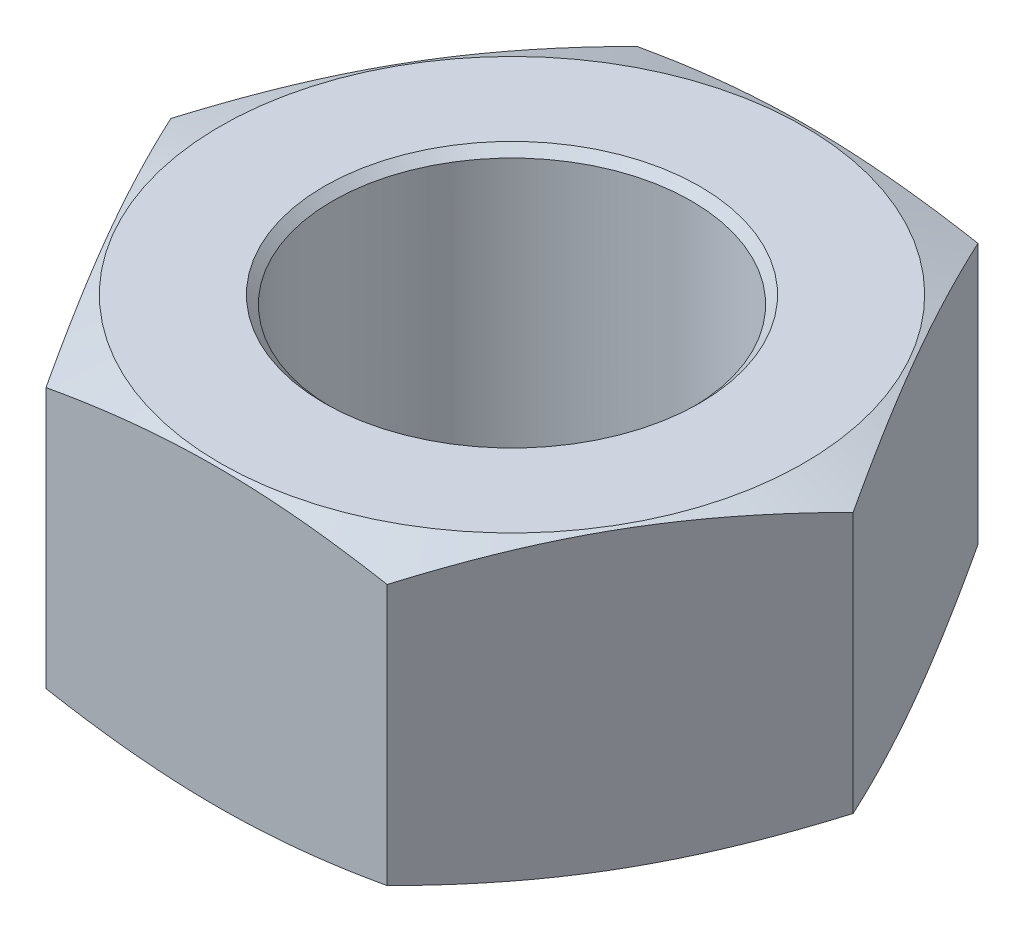
ISO-10303-21;
HEADER;
FILE_DESCRIPTION(('STEP AP214'),'2;1');
FILE_NAME('part.step','',(''),(''),'','','');
FILE_SCHEMA(('AUTOMOTIVE_DESIGN { 1 0 10303 214 1 1 1 1 }'));
ENDSEC;
DATA;
#1=APPLICATION_CONTEXT('core data for automotive mechanical design processes');
#2=APPLICATION_PROTOCOL_DEFINITION('international standard','automotive_design',2000,#1);
#3=PRODUCT_CONTEXT('',#1,'mechanical');
#4=PRODUCT('Part','Part','',(#3));
#5=PRODUCT_RELATED_PRODUCT_CATEGORY('part','',(#4));
#6=PRODUCT_DEFINITION_FORMATION('','',#4);
#7=PRODUCT_DEFINITION_CONTEXT('part definition',#1,'design');
#8=PRODUCT_DEFINITION('design','',#6,#7);
#9=PRODUCT_DEFINITION_SHAPE('','',#8);
#10=(LENGTH_UNIT() NAMED_UNIT(*) SI_UNIT(.MILLI.,.METRE.));
#11=(NAMED_UNIT(*) PLANE_ANGLE_UNIT() SI_UNIT($,.RADIAN.));
#12=(NAMED_UNIT(*) SI_UNIT($,.STERADIAN.) SOLID_ANGLE_UNIT());
#13=UNCERTAINTY_MEASURE_WITH_UNIT(LENGTH_MEASURE(1.E-05),#10,'distance_accuracy_value','');
#14=(GEOMETRIC_REPRESENTATION_CONTEXT(3) GLOBAL_UNCERTAINTY_ASSIGNED_CONTEXT((#13)) GLOBAL_UNIT_ASSIGNED_CONTEXT((#10,
#11,#12)) REPRESENTATION_CONTEXT('',''));
#15=CARTESIAN_POINT('',(0.,0.,0.));
#16=DIRECTION('',(0.,0.,1.));
#17=DIRECTION('',(1.,0.,0.));
#18=AXIS2_PLACEMENT_3D('',#15,#16,#17);
#19=CARTESIAN_POINT('',(8.08290376865476,7.,0.));
#20=DIRECTION('',(-0.866025403784438,0.,0.5));
#21=DIRECTION('',(0.5,0.,0.866025403784439));
#22=AXIS2_PLACEMENT_3D('',#19,#20,#21);
#23=PLANE('',#22);
#24=CARTESIAN_POINT('',(4.04133641427354,0.396064374006002,-7.0002));
#25=CARTESIAN_POINT('',(4.20871133711686,0.335122246639037,-6.71029812972245));
#26=CARTESIAN_POINT('',(4.37663818867554,0.279684845159646,-6.41944029086774));
#27=CARTESIAN_POINT('',(4.71358376499552,0.182151327336367,-5.83583343329596));
#28=CARTESIAN_POINT('',(4.88260323922986,0.140065650577549,-5.5430831164535));
#29=CARTESIAN_POINT('',(5.21985834048189,0.0719932787650601,-4.9589401459732));
#30=CARTESIAN_POINT('',(5.3880862654455,0.0458581080277518,-4.66756083268435));
#31=CARTESIAN_POINT('',(5.72493551662129,0.0108034998647018,-4.08412081515635));
#32=CARTESIAN_POINT('',(5.89355667155618,0.0018776070778526,-3.79206040757817));
#33=CARTESIAN_POINT('',(6.23079898142596,0.00187760707785253,-3.20793959242183));
#34=CARTESIAN_POINT('',(6.39942013636085,0.0108034998647017,-2.91587918484365));
#35=CARTESIAN_POINT('',(6.73626938753664,0.0458581080277515,-2.33243916731566));
#36=CARTESIAN_POINT('',(6.90449731250025,0.0719932787650598,-2.0410598540268));
#37=CARTESIAN_POINT('',(7.24175241375227,0.140065650577549,-1.45691688354651));
#38=CARTESIAN_POINT('',(7.41077188798662,0.182151327336367,-1.16416656670404));
#39=CARTESIAN_POINT('',(7.7477174643066,0.279684845159646,-0.58055970913226));
#40=CARTESIAN_POINT('',(7.91564431586528,0.335122246639037,-0.289701870277549));
#41=CARTESIAN_POINT('',(8.0830192387086,0.396064374006002,0.000199999999998937));
#42=B_SPLINE_CURVE_WITH_KNOTS('',3,(#24,#25,#26,#27,#28,#29,#30,#31,#32,#33,#34,#35,#36,#37,#38,
#39,#40,#41),.UNSPECIFIED.,.F.,.F.,(4,2,2,2,2,2,2,2,4),(0.,1.02086119756332,2.04251864059741,
3.05451483401204,4.06613134427776,5.07774785454349,6.08974404795813,7.11140149099221,
8.13226268855553),.UNSPECIFIED.);
#43=CARTESIAN_POINT('',(4.04145188432738,0.396022345442876,-7.));
#44=VERTEX_POINT('',#43);
#45=CARTESIAN_POINT('',(8.08290376865476,0.396022345442876,0.));
#46=VERTEX_POINT('',#45);
#47=EDGE_CURVE('E53',#44,#46,#42,.T.);
#48=ORIENTED_EDGE('',*,*,#47,.F.);
#49=DIRECTION('',(0.,-1.,0.));
#50=VECTOR('',#49,1.);
#51=CARTESIAN_POINT('',(4.04145188432738,7.,-7.));
#52=LINE('',#51,#50);
#53=CARTESIAN_POINT('',(4.04145188432738,6.57467753879998,-7.));
#54=VERTEX_POINT('',#53);
#55=EDGE_CURVE('E123',#54,#44,#52,.T.);
#56=ORIENTED_EDGE('',*,*,#55,.F.);
#57=CARTESIAN_POINT('',(8.0830192387086,6.57463551023685,0.000199999999998542));
#58=CARTESIAN_POINT('',(7.91564431586528,6.63557763760382,-0.289701870277549));
#59=CARTESIAN_POINT('',(7.7477174643066,6.69101503908321,-0.58055970913226));
#60=CARTESIAN_POINT('',(7.41077188798662,6.78854855690649,-1.16416656670404));
#61=CARTESIAN_POINT('',(7.24175241375227,6.83063423366531,-1.45691688354651));
#62=CARTESIAN_POINT('',(6.90449731250025,6.89870660547779,-2.0410598540268));
#63=CARTESIAN_POINT('',(6.73626938753664,6.9248417762151,-2.33243916731566));
#64=CARTESIAN_POINT('',(6.39942013636085,6.95989638437815,-2.91587918484365));
#65=CARTESIAN_POINT('',(6.23079898142596,6.968822277165,-3.20793959242183));
#66=CARTESIAN_POINT('',(5.89355667155618,6.968822277165,-3.79206040757817));
#67=CARTESIAN_POINT('',(5.72493551662129,6.95989638437815,-4.08412081515635));
#68=CARTESIAN_POINT('',(5.3880862654455,6.9248417762151,-4.66756083268435));
#69=CARTESIAN_POINT('',(5.21985834048189,6.89870660547779,-4.9589401459732));
#70=CARTESIAN_POINT('',(4.88260323922986,6.83063423366531,-5.5430831164535));
#71=CARTESIAN_POINT('',(4.71358376499552,6.78854855690649,-5.83583343329596));
#72=CARTESIAN_POINT('',(4.37663818867554,6.69101503908321,-6.41944029086774));
#73=CARTESIAN_POINT('',(4.20871133711686,6.63557763760382,-6.71029812972245));
#74=CARTESIAN_POINT('',(4.04133641427354,6.57463551023685,-7.0002));
#75=B_SPLINE_CURVE_WITH_KNOTS('',3,(#57,#58,#59,#60,#61,#62,#63,#64,#65,#66,#67,#68,#69,#70,#71,
#72,#73,#74),.UNSPECIFIED.,.F.,.F.,(4,2,2,2,2,2,2,2,4),(0.,1.02086119756332,2.04251864059741,
3.05451483401204,4.06613134427776,5.07774785454349,6.08974404795813,7.11140149099221,
8.13226268855553),.UNSPECIFIED.);
#76=CARTESIAN_POINT('',(8.08290376865476,6.57467753879998,0.));
#77=VERTEX_POINT('',#76);
#78=EDGE_CURVE('E158',#77,#54,#75,.T.);
#79=ORIENTED_EDGE('',*,*,#78,.F.);
#80=DIRECTION('',(0.,-1.,0.));
#81=VECTOR('',#80,1.);
#82=CARTESIAN_POINT('',(8.08290376865476,7.,0.));
#83=LINE('',#82,#81);
#84=EDGE_CURVE('E110',#77,#46,#83,.T.);
#85=ORIENTED_EDGE('',*,*,#84,.T.);
#86=EDGE_LOOP('',(#48,#56,#79,#85));
#87=FACE_BOUND('',#86,.T.);
#88=ADVANCED_FACE('F38',(#87),#23,.F.);
#89=CARTESIAN_POINT('',(4.04145188432738,7.,-7.));
#90=DIRECTION('',(0.,0.,1.));
#91=DIRECTION('',(1.,0.,0.));
#92=AXIS2_PLACEMENT_3D('',#89,#90,#91);
#93=PLANE('',#92);
#94=CARTESIAN_POINT('',(-10.8288839499322,2.14725212980072,-7.));
#95=CARTESIAN_POINT('',(-10.5103546094838,2.0499147553114,-7.));
#96=CARTESIAN_POINT('',(-10.1914801724842,1.95368649307686,-7.));
#97=CARTESIAN_POINT('',(-9.55286470063456,1.76406263347738,-7.));
#98=CARTESIAN_POINT('',(-9.23312360158148,1.67066725258925,-7.));
#99=CARTESIAN_POINT('',(-8.59210324325858,1.48718300549259,-7.));
#100=CARTESIAN_POINT('',(-8.27082229420456,1.39710002195854,-7.));
#101=CARTESIAN_POINT('',(-7.62708086199487,1.22125815747448,-7.));
#102=CARTESIAN_POINT('',(-7.30462039951449,1.13549920111592,-7.));
#103=CARTESIAN_POINT('',(-6.66301371562166,0.970590561460358,-7.));
#104=CARTESIAN_POINT('',(-6.34388766364484,0.891362783385371,-7.));
#105=CARTESIAN_POINT('',(-5.70406379199733,0.739459921329114,-7.));
#106=CARTESIAN_POINT('',(-5.38336594666204,0.666784944721844,-7.));
#107=CARTESIAN_POINT('',(-4.74028409918753,0.529632904917309,-7.));
#108=CARTESIAN_POINT('',(-4.41790049972417,0.465153969419512,-7.));
#109=CARTESIAN_POINT('',(-3.77125819758374,0.346322547099357,-7.));
#110=CARTESIAN_POINT('',(-3.44699955402845,0.291969742766986,-7.));
#111=CARTESIAN_POINT('',(-2.83271052104426,0.20090600889886,-7.));
#112=CARTESIAN_POINT('',(-2.54287287941538,0.162906971624213,-7.));
#113=CARTESIAN_POINT('',(-1.96193465266254,0.0981435439813421,-7.));
#114=CARTESIAN_POINT('',(-1.67083410488204,0.0713788236772363,-7.));
#115=CARTESIAN_POINT('',(-1.08798926355639,0.0303704099183644,-7.));
#116=CARTESIAN_POINT('',(-0.796245737421936,0.0161159846260388,-7.));
#117=CARTESIAN_POINT('',(-0.212408622772339,0.000847017679897926,-7.));
#118=CARTESIAN_POINT('',(0.0796849629010389,-0.000167630735438414,-7.));
#119=CARTESIAN_POINT('',(0.66563447444041,0.0111386033102869,-7.));
#120=CARTESIAN_POINT('',(0.959488588099098,0.0235519348918809,-7.));
#121=CARTESIAN_POINT('',(1.54636923330975,0.0611843169462709,-7.));
#122=CARTESIAN_POINT('',(1.83939574231318,0.086403713006614,-7.));
#123=CARTESIAN_POINT('',(2.42449575038683,0.148442077607243,-7.));
#124=CARTESIAN_POINT('',(2.71656800891666,0.185272579229821,-7.));
#125=CARTESIAN_POINT('',(3.29923932227263,0.268997693771006,-7.));
#126=CARTESIAN_POINT('',(3.58983841119636,0.315892072655093,-7.));
#127=CARTESIAN_POINT('',(4.29347170917687,0.440033587463134,-7.));
#128=CARTESIAN_POINT('',(4.7057250046913,0.521685271153699,-7.));
#129=CARTESIAN_POINT('',(5.52742475762459,0.698168723283092,-7.));
#130=CARTESIAN_POINT('',(5.93687069848898,0.793002852442231,-7.));
#131=CARTESIAN_POINT('',(6.75358315639123,0.992642791392257,-7.));
#132=CARTESIAN_POINT('',(7.16084810211974,1.09745497614811,-7.));
#133=CARTESIAN_POINT('',(7.97334250308076,1.3145415387155,-7.));
#134=CARTESIAN_POINT('',(8.37857208453993,1.4268154474727,-7.));
#135=CARTESIAN_POINT('',(9.18839221363026,1.6573159878492,-7.));
#136=CARTESIAN_POINT('',(9.59297881421302,1.77555642442952,-7.));
#137=CARTESIAN_POINT('',(10.4008458876181,2.01642009167769,-7.));
#138=CARTESIAN_POINT('',(10.8041263454444,2.13904337247286,-7.));
#139=CARTESIAN_POINT('',(11.6094819513514,2.38765637193747,-7.));
#140=CARTESIAN_POINT('',(12.0115574910568,2.51364482492323,-7.));
#141=CARTESIAN_POINT('',(12.8148492646953,2.76832032701244,-7.));
#142=CARTESIAN_POINT('',(13.2160655026799,2.8970073633615,-7.));
#143=CARTESIAN_POINT('',(14.4013628039604,3.2806775720889,-7.));
#144=CARTESIAN_POINT('',(15.184462619904,3.53869025816283,-7.));
#145=CARTESIAN_POINT('',(16.7489191895378,4.06020503900663,-7.));
#146=CARTESIAN_POINT('',(17.5302757428736,4.32370773205579,-7.));
#147=CARTESIAN_POINT('',(19.0872079467471,4.85302635545361,-7.));
#148=CARTESIAN_POINT('',(19.8627910578921,5.11882036299614,-7.));
#149=CARTESIAN_POINT('',(21.0254021708859,5.51955624735791,-7.));
#150=CARTESIAN_POINT('',(21.4127864013356,5.65346677997084,-7.));
#151=CARTESIAN_POINT('',(22.1873469814177,5.92188592528232,-7.));
#152=CARTESIAN_POINT('',(22.5745233313585,6.05639453709059,-7.));
#153=CARTESIAN_POINT('',(22.9616110780881,6.19115776759808,-7.));
#154=B_SPLINE_CURVE_WITH_KNOTS('',3,(#94,#95,#96,#97,#98,#99,#100,#101,#102,#103,#104,#105,#106,
#107,#108,#109,#110,#111,#112,#113,#114,#115,#116,#117,#118,#119,#120,#121,#122,#123,#124,#125,
#126,#127,#128,#129,#130,#131,#132,#133,#134,#135,#136,#137,#138,#139,#140,#141,#142,#143,#144,
#145,#146,#147,#148,#149,#150,#151,#152,#153),.UNSPECIFIED.,.F.,.F.,(4,2,2,2,2,2,2,2,2,2,2,2,2,
2,2,2,2,2,2,2,2,2,2,2,2,2,2,2,2,4),(0.,0.999216279059921,1.99850872261269,2.99949767093117,
4.0004691565376,4.98685575676647,5.97325851695896,6.95943553716344,7.94558163007766,
8.82234670627914,9.69908603133767,10.5750725166995,11.4510519383692,12.3331009238614,
13.2151737138057,14.0981254244802,14.9810566044203,16.2415328125197,17.5022350389645,
18.7637482020018,20.0251821394413,21.2896820170662,22.554196361619,23.818241623565,
25.082280912561,27.5557739825682,30.0295380287597,32.4891198013207,33.7187483486324,
34.9483750662024),.UNSPECIFIED.);
#155=CARTESIAN_POINT('',(-4.04145188432738,0.396022345442877,-7.));
#156=VERTEX_POINT('',#155);
#157=EDGE_CURVE('E174',#156,#44,#154,.T.);
#158=ORIENTED_EDGE('',*,*,#157,.F.);
#159=DIRECTION('',(0.,-1.,0.));
#160=VECTOR('',#159,1.);
#161=CARTESIAN_POINT('',(-4.04145188432738,7.,-7.));
#162=LINE('',#161,#160);
#163=CARTESIAN_POINT('',(-4.04145188432738,6.57467753879998,-7.));
#164=VERTEX_POINT('',#163);
#165=EDGE_CURVE('E120',#164,#156,#162,.T.);
#166=ORIENTED_EDGE('',*,*,#165,.F.);
#167=CARTESIAN_POINT('',(-10.8240084136491,4.82493794934905,-7.));
#168=CARTESIAN_POINT('',(-10.5055308173541,4.92224656897644,-7.));
#169=CARTESIAN_POINT('',(-10.1867079395454,5.01844535323185,-7.));
#170=CARTESIAN_POINT('',(-9.54819513137422,5.20800839484679,-7.));
#171=CARTESIAN_POINT('',(-9.22850513667269,5.30137243523613,-7.));
#172=CARTESIAN_POINT('',(-8.58758547741601,5.48479197085715,-7.));
#173=CARTESIAN_POINT('',(-8.26635411877152,5.57484156729345,-7.));
#174=CARTESIAN_POINT('',(-7.62271136787224,5.75061376866334,-7.));
#175=CARTESIAN_POINT('',(-7.30029999633585,5.83633644918072,-7.));
#176=CARTESIAN_POINT('',(-6.65879828459734,6.00116750922599,-7.));
#177=CARTESIAN_POINT('',(-6.33972815490249,6.08035416624466,-7.));
#178=CARTESIAN_POINT('',(-5.70001584284803,6.23217107284474,-7.));
#179=CARTESIAN_POINT('',(-5.37937363480482,6.30480121493127,-7.));
#180=CARTESIAN_POINT('',(-4.73640364991016,6.44185933588268,-7.));
#181=CARTESIAN_POINT('',(-4.41407627902635,6.50628920330615,-7.));
#182=CARTESIAN_POINT('',(-3.76754696125269,6.62501836866435,-7.));
#183=CARTESIAN_POINT('',(-3.44334507358089,6.67931798484162,-7.));
#184=CARTESIAN_POINT('',(-2.82917617271211,6.77027638187317,-7.));
#185=CARTESIAN_POINT('',(-2.53940183260569,6.80822401100627,-7.));
#186=CARTESIAN_POINT('',(-1.95859192158745,6.8728843624809,-7.));
#187=CARTESIAN_POINT('',(-1.66755638799729,6.89959741501675,-7.));
#188=CARTESIAN_POINT('',(-1.0848432623255,6.94050465180896,-7.));
#189=CARTESIAN_POINT('',(-0.793166434547837,6.9547095484949,-7.));
#190=CARTESIAN_POINT('',(-0.209464911720636,6.96988428213895,-7.));
#191=CARTESIAN_POINT('',(0.0825597805388067,6.97085422454456,-7.));
#192=CARTESIAN_POINT('',(0.668372835377888,6.95946555254062,-7.));
#193=CARTESIAN_POINT('',(0.962159369824402,6.94701437349206,-7.));
#194=CARTESIAN_POINT('',(1.54890375241079,6.90931500259176,-7.));
#195=CARTESIAN_POINT('',(1.84186157797401,6.8840664654123,-7.));
#196=CARTESIAN_POINT('',(2.42682371060595,6.82197890274991,-7.));
#197=CARTESIAN_POINT('',(2.71882677751656,6.78512835942758,-7.));
#198=CARTESIAN_POINT('',(3.30136001363118,6.70137164138962,-7.));
#199=CARTESIAN_POINT('',(3.59189021714083,6.65446570199405,-7.));
#200=CARTESIAN_POINT('',(4.29591172682075,6.53020715835121,-7.));
#201=CARTESIAN_POINT('',(4.70861839516711,6.44843063706516,-7.));
#202=CARTESIAN_POINT('',(5.53121961611645,6.27167832197565,-7.));
#203=CARTESIAN_POINT('',(5.94111365008252,6.17670015902581,-7.));
#204=CARTESIAN_POINT('',(6.75871928435894,5.97676083796844,-7.));
#205=CARTESIAN_POINT('',(7.16642930834378,5.87179328714549,-7.));
#206=CARTESIAN_POINT('',(7.97981135309997,5.65438980965387,-7.));
#207=CARTESIAN_POINT('',(8.38548350057627,5.54195435364193,-7.));
#208=CARTESIAN_POINT('',(9.19618908932204,5.3111267907803,-7.));
#209=CARTESIAN_POINT('',(9.60121857701305,5.19272086061553,-7.));
#210=CARTESIAN_POINT('',(10.4099705668438,4.95152451801167,-7.));
#211=CARTESIAN_POINT('',(10.8136930539317,4.82873405527329,-7.));
#212=CARTESIAN_POINT('',(11.6199318152718,4.57978610351217,-7.));
#213=CARTESIAN_POINT('',(12.0224484819861,4.45362988256405,-7.));
#214=CARTESIAN_POINT('',(12.8266222552163,4.19861865452416,-7.));
#215=CARTESIAN_POINT('',(13.2282793657932,4.06976366021396,-7.));
#216=CARTESIAN_POINT('',(14.4147995035738,3.68562309580923,-7.));
#217=CARTESIAN_POINT('',(15.1986814181995,3.42730901725608,-7.));
#218=CARTESIAN_POINT('',(16.7647029115578,2.90519359165718,-7.));
#219=CARTESIAN_POINT('',(17.546842289611,2.64139164544921,-7.));
#220=CARTESIAN_POINT('',(19.1053355153589,2.1114783806791,-7.));
#221=CARTESIAN_POINT('',(19.8816968218466,1.84538897698207,-7.));
#222=CARTESIAN_POINT('',(21.0454754652962,1.44421124070768,-7.));
#223=CARTESIAN_POINT('',(21.4332488571115,1.31015365107045,-7.));
#224=CARTESIAN_POINT('',(22.2085878686218,1.04144075587337,-7.));
#225=CARTESIAN_POINT('',(22.5961534886243,0.90678545120091,-7.));
#226=CARTESIAN_POINT('',(22.983630555226,0.771875691808589,-7.));
#227=B_SPLINE_CURVE_WITH_KNOTS('',3,(#167,#168,#169,#170,#171,#172,#173,#174,#175,#176,#177,
#178,#179,#180,#181,#182,#183,#184,#185,#186,#187,#188,#189,#190,#191,#192,#193,#194,#195,#196,
#197,#198,#199,#200,#201,#202,#203,#204,#205,#206,#207,#208,#209,#210,#211,#212,#213,#214,#215,
#216,#217,#218,#219,#220,#221,#222,#223,#224,#225,#226),.UNSPECIFIED.,.F.,.F.,(4,2,2,2,2,2,2,2,
2,2,2,2,2,2,2,2,2,2,2,2,2,2,2,2,2,2,2,2,2,4),(0.,0.999042624072088,1.99816152269297,
2.99898014861877,3.99978128590735,4.98597526791184,5.97218541575433,6.95816802256749,
7.94411964945086,8.82067631436884,9.69720721469674,10.5729866905991,11.4487591888565,
12.3306107126278,13.2124860338102,14.0952396080554,14.9779725260343,16.2398549344268,
17.5019640913832,18.7648864379689,20.027729265612,21.2936437363914,22.5595727343897,
23.825031338086,25.0904839498416,27.5664884808426,30.0427647742738,32.5048423574256,
33.735718458982,34.9665927337716),.UNSPECIFIED.);
#228=EDGE_CURVE('E225',#54,#164,#227,.F.);
#229=ORIENTED_EDGE('',*,*,#228,.F.);
#230=ORIENTED_EDGE('',*,*,#55,.T.);
#231=EDGE_LOOP('',(#158,#166,#229,#230));
#232=FACE_BOUND('',#231,.T.);
#233=ADVANCED_FACE('F145',(#232),#93,.F.);
#234=CARTESIAN_POINT('',(-4.04145188432738,7.,-7.));
#235=DIRECTION('',(0.866025403784439,0.,0.5));
#236=DIRECTION('',(0.5,0.,-0.866025403784439));
#237=AXIS2_PLACEMENT_3D('',#234,#235,#236);
#238=PLANE('',#237);
#239=CARTESIAN_POINT('',(-8.0830192387086,0.396064374006002,0.000200000000002738));
#240=CARTESIAN_POINT('',(-7.91564431586528,0.335122246639036,-0.289701870277546));
#241=CARTESIAN_POINT('',(-7.7477174643066,0.279684845159646,-0.580559709132257));
#242=CARTESIAN_POINT('',(-7.41077188798662,0.182151327336367,-1.16416656670403));
#243=CARTESIAN_POINT('',(-7.24175241375227,0.140065650577549,-1.4569168835465));
#244=CARTESIAN_POINT('',(-6.90449731250025,0.0719932787650599,-2.0410598540268));
#245=CARTESIAN_POINT('',(-6.73626938753664,0.0458581080277514,-2.33243916731565));
#246=CARTESIAN_POINT('',(-6.39942013636085,0.0108034998647016,-2.91587918484365));
#247=CARTESIAN_POINT('',(-6.23079898142596,0.00187760707785259,-3.20793959242183));
#248=CARTESIAN_POINT('',(-5.89355667155618,0.00187760707785265,-3.79206040757817));
#249=CARTESIAN_POINT('',(-5.72493551662129,0.0108034998647017,-4.08412081515635));
#250=CARTESIAN_POINT('',(-5.3880862654455,0.0458581080277516,-4.66756083268434));
#251=CARTESIAN_POINT('',(-5.21985834048189,0.0719932787650601,-4.9589401459732));
#252=CARTESIAN_POINT('',(-4.88260323922987,0.140065650577549,-5.54308311645349));
#253=CARTESIAN_POINT('',(-4.71358376499552,0.182151327336367,-5.83583343329596));
#254=CARTESIAN_POINT('',(-4.37663818867554,0.279684845159646,-6.41944029086774));
#255=CARTESIAN_POINT('',(-4.20871133711686,0.335122246639037,-6.71029812972245));
#256=CARTESIAN_POINT('',(-4.04133641427354,0.396064374006003,-7.0002));
#257=B_SPLINE_CURVE_WITH_KNOTS('',3,(#239,#240,#241,#242,#243,#244,#245,#246,#247,#248,#249,
#250,#251,#252,#253,#254,#255,#256),.UNSPECIFIED.,.F.,.F.,(4,2,2,2,2,2,2,2,4),(0.,
1.02086119756332,2.04251864059741,3.05451483401204,4.06613134427777,5.07774785454349,
6.08974404795813,7.11140149099221,8.13226268855553),.UNSPECIFIED.);
#258=CARTESIAN_POINT('',(-8.08290376865476,0.396022345442876,0.));
#259=VERTEX_POINT('',#258);
#260=EDGE_CURVE('E207',#259,#156,#257,.T.);
#261=ORIENTED_EDGE('',*,*,#260,.F.);
#262=DIRECTION('',(0.,-1.,0.));
#263=VECTOR('',#262,1.);
#264=CARTESIAN_POINT('',(-8.08290376865476,7.,0.));
#265=LINE('',#264,#263);
#266=CARTESIAN_POINT('',(-8.08290376865476,6.57467753879998,0.));
#267=VERTEX_POINT('',#266);
#268=EDGE_CURVE('E112',#267,#259,#265,.T.);
#269=ORIENTED_EDGE('',*,*,#268,.F.);
#270=CARTESIAN_POINT('',(-4.04133641427354,6.57463551023685,-7.0002));
#271=CARTESIAN_POINT('',(-4.20871133711686,6.63557763760382,-6.71029812972245));
#272=CARTESIAN_POINT('',(-4.37663818867554,6.69101503908321,-6.41944029086774));
#273=CARTESIAN_POINT('',(-4.71358376499552,6.78854855690649,-5.83583343329596));
#274=CARTESIAN_POINT('',(-4.88260323922987,6.83063423366531,-5.54308311645349));
#275=CARTESIAN_POINT('',(-5.21985834048189,6.89870660547779,-4.9589401459732));
#276=CARTESIAN_POINT('',(-5.3880862654455,6.9248417762151,-4.66756083268434));
#277=CARTESIAN_POINT('',(-5.72493551662129,6.95989638437815,-4.08412081515635));
#278=CARTESIAN_POINT('',(-5.89355667155618,6.968822277165,-3.79206040757817));
#279=CARTESIAN_POINT('',(-6.23079898142596,6.968822277165,-3.20793959242183));
#280=CARTESIAN_POINT('',(-6.39942013636085,6.95989638437815,-2.91587918484365));
#281=CARTESIAN_POINT('',(-6.73626938753664,6.9248417762151,-2.33243916731565));
#282=CARTESIAN_POINT('',(-6.90449731250025,6.89870660547779,-2.0410598540268));
#283=CARTESIAN_POINT('',(-7.24175241375227,6.83063423366531,-1.4569168835465));
#284=CARTESIAN_POINT('',(-7.41077188798662,6.78854855690649,-1.16416656670403));
#285=CARTESIAN_POINT('',(-7.7477174643066,6.69101503908321,-0.580559709132257));
#286=CARTESIAN_POINT('',(-7.91564431586528,6.63557763760382,-0.289701870277546));
#287=CARTESIAN_POINT('',(-8.0830192387086,6.57463551023685,0.000200000000002501));
#288=B_SPLINE_CURVE_WITH_KNOTS('',3,(#270,#271,#272,#273,#274,#275,#276,#277,#278,#279,#280,
#281,#282,#283,#284,#285,#286,#287),.UNSPECIFIED.,.F.,.F.,(4,2,2,2,2,2,2,2,4),(0.,
1.02086119756332,2.04251864059741,3.05451483401204,4.06613134427776,5.07774785454349,
6.08974404795812,7.11140149099221,8.13226268855553),.UNSPECIFIED.);
#289=EDGE_CURVE('E219',#164,#267,#288,.T.);
#290=ORIENTED_EDGE('',*,*,#289,.F.);
#291=ORIENTED_EDGE('',*,*,#165,.T.);
#292=EDGE_LOOP('',(#261,#269,#290,#291));
#293=FACE_BOUND('',#292,.T.);
#294=ADVANCED_FACE('F150',(#293),#238,.F.);
#295=CARTESIAN_POINT('',(-8.08290376865476,7.,0.));
#296=DIRECTION('',(0.866025403784438,0.,-0.5));
#297=DIRECTION('',(-0.5,0.,-0.866025403784438));
#298=AXIS2_PLACEMENT_3D('',#295,#296,#297);
#299=PLANE('',#298);
#300=CARTESIAN_POINT('',(-4.04133641427354,0.396064374006002,7.0002));
#301=CARTESIAN_POINT('',(-4.20871133711686,0.335122246639036,6.71029812972245));
#302=CARTESIAN_POINT('',(-4.37663818867554,0.279684845159645,6.41944029086774));
#303=CARTESIAN_POINT('',(-4.71358376499551,0.182151327336367,5.83583343329596));
#304=CARTESIAN_POINT('',(-4.88260323922986,0.140065650577549,5.5430831164535));
#305=CARTESIAN_POINT('',(-5.21985834048189,0.0719932787650603,4.9589401459732));
#306=CARTESIAN_POINT('',(-5.3880862654455,0.0458581080277516,4.66756083268435));
#307=CARTESIAN_POINT('',(-5.72493551662129,0.0108034998647017,4.08412081515635));
#308=CARTESIAN_POINT('',(-5.89355667155618,0.00187760707785265,3.79206040757818));
#309=CARTESIAN_POINT('',(-6.23079898142596,0.0018776070778526,3.20793959242183));
#310=CARTESIAN_POINT('',(-6.39942013636085,0.0108034998647016,2.91587918484366));
#311=CARTESIAN_POINT('',(-6.73626938753664,0.0458581080277514,2.33243916731566));
#312=CARTESIAN_POINT('',(-6.90449731250025,0.07199327876506,2.0410598540268));
#313=CARTESIAN_POINT('',(-7.24175241375227,0.140065650577549,1.45691688354651));
#314=CARTESIAN_POINT('',(-7.41077188798662,0.182151327336367,1.16416656670404));
#315=CARTESIAN_POINT('',(-7.7477174643066,0.279684845159646,0.580559709132261));
#316=CARTESIAN_POINT('',(-7.91564431586528,0.335122246639037,0.28970187027755));
#317=CARTESIAN_POINT('',(-8.0830192387086,0.396064374006002,-0.000199999999997889));
#318=B_SPLINE_CURVE_WITH_KNOTS('',3,(#300,#301,#302,#303,#304,#305,#306,#307,#308,#309,#310,
#311,#312,#313,#314,#315,#316,#317),.UNSPECIFIED.,.F.,.F.,(4,2,2,2,2,2,2,2,4),(0.,
1.02086119756332,2.0425186405974,3.05451483401204,4.06613134427776,5.07774785454349,
6.08974404795812,7.11140149099221,8.13226268855553),.UNSPECIFIED.);
#319=CARTESIAN_POINT('',(-4.04145188432739,0.396022345442856,7.));
#320=VERTEX_POINT('',#319);
#321=EDGE_CURVE('E106',#320,#259,#318,.T.);
#322=ORIENTED_EDGE('',*,*,#321,.F.);
#323=DIRECTION('',(0.,-1.,0.));
#324=VECTOR('',#323,1.);
#325=CARTESIAN_POINT('',(-4.04145188432738,7.,7.));
#326=LINE('',#325,#324);
#327=CARTESIAN_POINT('',(-4.04145188432739,6.5746775388,7.));
#328=VERTEX_POINT('',#327);
#329=EDGE_CURVE('E105',#328,#320,#326,.T.);
#330=ORIENTED_EDGE('',*,*,#329,.F.);
#331=CARTESIAN_POINT('',(-8.0830192387086,6.57463551023685,-0.000199999999997322));
#332=CARTESIAN_POINT('',(-7.91564431586528,6.63557763760382,0.28970187027755));
#333=CARTESIAN_POINT('',(-7.7477174643066,6.69101503908321,0.580559709132262));
#334=CARTESIAN_POINT('',(-7.41077188798662,6.78854855690649,1.16416656670404));
#335=CARTESIAN_POINT('',(-7.24175241375227,6.83063423366531,1.45691688354651));
#336=CARTESIAN_POINT('',(-6.90449731250025,6.89870660547779,2.0410598540268));
#337=CARTESIAN_POINT('',(-6.73626938753664,6.9248417762151,2.33243916731566));
#338=CARTESIAN_POINT('',(-6.39942013636085,6.95989638437815,2.91587918484366));
#339=CARTESIAN_POINT('',(-6.23079898142596,6.968822277165,3.20793959242183));
#340=CARTESIAN_POINT('',(-5.89355667155618,6.968822277165,3.79206040757818));
#341=CARTESIAN_POINT('',(-5.72493551662129,6.95989638437815,4.08412081515635));
#342=CARTESIAN_POINT('',(-5.3880862654455,6.9248417762151,4.66756083268435));
#343=CARTESIAN_POINT('',(-5.21985834048189,6.89870660547779,4.9589401459732));
#344=CARTESIAN_POINT('',(-4.88260323922986,6.83063423366531,5.5430831164535));
#345=CARTESIAN_POINT('',(-4.71358376499551,6.78854855690649,5.83583343329596));
#346=CARTESIAN_POINT('',(-4.37663818867554,6.69101503908321,6.41944029086774));
#347=CARTESIAN_POINT('',(-4.20871133711686,6.63557763760382,6.71029812972245));
#348=CARTESIAN_POINT('',(-4.04133641427354,6.57463551023685,7.0002));
#349=B_SPLINE_CURVE_WITH_KNOTS('',3,(#331,#332,#333,#334,#335,#336,#337,#338,#339,#340,#341,
#342,#343,#344,#345,#346,#347,#348),.UNSPECIFIED.,.F.,.F.,(4,2,2,2,2,2,2,2,4),(0.,
1.02086119756332,2.04251864059741,3.05451483401204,4.06613134427776,5.07774785454349,
6.08974404795813,7.11140149099221,8.13226268855553),.UNSPECIFIED.);
#350=EDGE_CURVE('E226',#267,#328,#349,.T.);
#351=ORIENTED_EDGE('',*,*,#350,.F.);
#352=ORIENTED_EDGE('',*,*,#268,.T.);
#353=EDGE_LOOP('',(#322,#330,#351,#352));
#354=FACE_BOUND('',#353,.T.);
#355=ADVANCED_FACE('F214',(#354),#299,.F.);
#356=CARTESIAN_POINT('',(-4.04145188432738,7.,7.));
#357=DIRECTION('',(0.,0.,-1.));
#358=DIRECTION('',(-1.,0.,0.));
#359=AXIS2_PLACEMENT_3D('',#356,#357,#358);
#360=PLANE('',#359);
#361=CARTESIAN_POINT('',(-10.8288839503398,2.14725212992529,7.));
#362=CARTESIAN_POINT('',(-10.5103546098755,2.04991475543006,7.));
#363=CARTESIAN_POINT('',(-10.19148017286,1.95368649318961,7.));
#364=CARTESIAN_POINT('',(-9.55286470097864,1.76406263357839,7.));
#365=CARTESIAN_POINT('',(-9.23312360190967,1.67066725268441,7.));
#366=CARTESIAN_POINT('',(-8.59210324355485,1.48718300557617,7.));
#367=CARTESIAN_POINT('',(-8.27082229448479,1.39710002203636,7.));
#368=CARTESIAN_POINT('',(-7.62708086224296,1.22125815754097,7.));
#369=CARTESIAN_POINT('',(-7.30462039974649,1.13549920117684,7.));
#370=CARTESIAN_POINT('',(-6.66301371582165,0.970590561510493,7.));
#371=CARTESIAN_POINT('',(-6.34388766382892,0.891362783430293,7.));
#372=CARTESIAN_POINT('',(-5.70406379214948,0.739459921364018,7.));
#373=CARTESIAN_POINT('',(-5.38336594679816,0.666784944751941,7.));
#374=CARTESIAN_POINT('',(-4.74028409929145,0.529632904938407,7.));
#375=CARTESIAN_POINT('',(-4.41790049981194,0.465153969436415,7.));
#376=CARTESIAN_POINT('',(-3.77125819763902,0.346322547108744,7.));
#377=CARTESIAN_POINT('',(-3.44699955406739,0.291969742773049,7.));
#378=CARTESIAN_POINT('',(-2.83271052107095,0.20090600890256,7.));
#379=CARTESIAN_POINT('',(-2.54287287944628,0.162906971628116,7.));
#380=CARTESIAN_POINT('',(-1.96193465270188,0.0981435439852705,7.));
#381=CARTESIAN_POINT('',(-1.67083410492561,0.0713788236809869,7.));
#382=CARTESIAN_POINT('',(-1.08798926360842,0.0303704099213416,7.));
#383=CARTESIAN_POINT('',(-0.796245737478191,0.0161159846284209,7.));
#384=CARTESIAN_POINT('',(-0.212408622837011,0.000847017680678865,7.));
#385=CARTESIAN_POINT('',(0.0796849628321731,-0.000167630735663602,7.));
#386=CARTESIAN_POINT('',(0.665634474363043,0.0111386033076822,7.));
#387=CARTESIAN_POINT('',(0.959488588017422,0.0235519348878937,7.));
#388=CARTESIAN_POINT('',(1.54636923321953,0.0611843169392346,7.));
#389=CARTESIAN_POINT('',(1.83939574221872,0.086403712997911,7.));
#390=CARTESIAN_POINT('',(2.42449575028395,0.14844207759502,7.));
#391=CARTESIAN_POINT('',(2.71656800880961,0.185272579215745,7.));
#392=CARTESIAN_POINT('',(3.29923932215728,0.268997693753123,7.));
#393=CARTESIAN_POINT('',(3.58983841107688,0.315892072635258,7.));
#394=CARTESIAN_POINT('',(4.29347170905316,0.440033587439526,7.));
#395=CARTESIAN_POINT('',(4.70572500456744,0.521685271128491,7.));
#396=CARTESIAN_POINT('',(5.52742475750043,0.698168723255032,7.));
#397=CARTESIAN_POINT('',(5.93687069836467,0.793002852412918,7.));
#398=CARTESIAN_POINT('',(6.75358315626656,0.992642791360706,7.));
#399=CARTESIAN_POINT('',(7.16084810199487,1.09745497611558,7.));
#400=CARTESIAN_POINT('',(7.97334250295547,1.31454153868119,7.));
#401=CARTESIAN_POINT('',(8.37857208441442,1.42681544743761,7.));
#402=CARTESIAN_POINT('',(9.18839221350433,1.65731598781272,7.));
#403=CARTESIAN_POINT('',(9.59297881408691,1.77555642439242,7.));
#404=CARTESIAN_POINT('',(10.4008458874916,2.01642009163947,7.));
#405=CARTESIAN_POINT('',(10.8041263453177,2.13904337243414,7.));
#406=CARTESIAN_POINT('',(11.6094819512242,2.38765637189783,7.));
#407=CARTESIAN_POINT('',(12.0115574909294,2.51364482488317,7.));
#408=CARTESIAN_POINT('',(12.8148492645674,2.76832032697159,7.));
#409=CARTESIAN_POINT('',(13.2160655025518,2.89700736332028,7.));
#410=CARTESIAN_POINT('',(14.4013628038338,3.2806775720474,7.));
#411=CARTESIAN_POINT('',(15.1844626197791,3.53869025812151,7.));
#412=CARTESIAN_POINT('',(16.7489191894162,4.06020503896578,7.));
#413=CARTESIAN_POINT('',(17.5302757427537,4.32370773201523,7.));
#414=CARTESIAN_POINT('',(19.0872079466302,4.85302635541364,7.));
#415=CARTESIAN_POINT('',(19.8627910577765,5.11882036295644,7.));
#416=CARTESIAN_POINT('',(21.0254021707723,5.51955624731866,7.));
#417=CARTESIAN_POINT('',(21.4127864012226,5.65346677993175,7.));
#418=CARTESIAN_POINT('',(22.187346981306,5.92188592524355,7.));
#419=CARTESIAN_POINT('',(22.5745233312474,6.05639453705198,7.));
#420=CARTESIAN_POINT('',(22.9616110779777,6.19115776755965,7.));
#421=B_SPLINE_CURVE_WITH_KNOTS('',3,(#361,#362,#363,#364,#365,#366,#367,#368,#369,#370,#371,
#372,#373,#374,#375,#376,#377,#378,#379,#380,#381,#382,#383,#384,#385,#386,#387,#388,#389,#390,
#391,#392,#393,#394,#395,#396,#397,#398,#399,#400,#401,#402,#403,#404,#405,#406,#407,#408,#409,
#410,#411,#412,#413,#414,#415,#416,#417,#418,#419,#420),.UNSPECIFIED.,.F.,.F.,(4,2,2,2,2,2,2,2,
2,2,2,2,2,2,2,2,2,2,2,2,2,2,2,2,2,2,2,2,2,4),(0.,0.999216279110595,1.99850872271404,
2.99949767108349,4.0004691567409,4.98685575701985,5.97325851726242,6.95943553751688,
7.94558163048106,8.82234670666996,9.6990860317159,10.5750725170651,11.4510519387223,
12.3331009242015,13.2151737141326,14.098125424794,14.981056604721,16.2415328128191,
17.5022350392625,18.7637482022985,20.0251821397367,21.2896820173606,22.5541963619123,
23.8182416238573,25.0822809128523,27.5557739828645,30.0295380290609,32.4891198016259,
33.7187483489396,34.9483750665116),.UNSPECIFIED.);
#422=CARTESIAN_POINT('',(4.04145188432738,0.396022345442877,7.));
#423=VERTEX_POINT('',#422);
#424=EDGE_CURVE('E91',#423,#320,#421,.F.);
#425=ORIENTED_EDGE('',*,*,#424,.F.);
#426=DIRECTION('',(0.,-1.,0.));
#427=VECTOR('',#426,1.);
#428=CARTESIAN_POINT('',(4.04145188432738,7.,7.));
#429=LINE('',#428,#427);
#430=CARTESIAN_POINT('',(4.04145188432738,6.57467753879998,7.));
#431=VERTEX_POINT('',#430);
#432=EDGE_CURVE('E103',#431,#423,#429,.T.);
#433=ORIENTED_EDGE('',*,*,#432,.F.);
#434=CARTESIAN_POINT('',(-10.8240084139952,4.82493794924327,7.));
#435=CARTESIAN_POINT('',(-10.5055308176868,4.92224656887569,7.));
#436=CARTESIAN_POINT('',(-10.1867079398646,5.01844535313612,7.));
#437=CARTESIAN_POINT('',(-9.54819513166643,5.20800839476103,7.));
#438=CARTESIAN_POINT('',(-9.2285051369514,5.30137243515533,7.));
#439=CARTESIAN_POINT('',(-8.58758547766761,5.48479197078619,7.));
#440=CARTESIAN_POINT('',(-8.2663541190095,5.57484156722738,7.));
#441=CARTESIAN_POINT('',(-7.62271136808293,5.75061376860689,7.));
#442=CARTESIAN_POINT('',(-7.30029999653286,5.83633644912901,7.));
#443=CARTESIAN_POINT('',(-6.65879828476717,6.00116750918343,7.));
#444=CARTESIAN_POINT('',(-6.33972815505883,6.08035416620652,7.));
#445=CARTESIAN_POINT('',(-5.70001584297724,6.23217107281511,7.));
#446=CARTESIAN_POINT('',(-5.37937363492041,6.30480121490572,7.));
#447=CARTESIAN_POINT('',(-4.73640364999842,6.44185933586477,7.));
#448=CARTESIAN_POINT('',(-4.4140762791009,6.5062892032918,7.));
#449=CARTESIAN_POINT('',(-3.76754696129964,6.62501836865638,7.));
#450=CARTESIAN_POINT('',(-3.44334507361397,6.67931798483647,7.));
#451=CARTESIAN_POINT('',(-2.82917617273478,6.77027638187003,7.));
#452=CARTESIAN_POINT('',(-2.53940183263192,6.80822401100296,7.));
#453=CARTESIAN_POINT('',(-1.95859192162084,6.87288436247757,7.));
#454=CARTESIAN_POINT('',(-1.66755638803426,6.89959741501358,7.));
#455=CARTESIAN_POINT('',(-1.08484326236963,6.94050465180644,7.));
#456=CARTESIAN_POINT('',(-0.793166434595548,6.95470954849288,7.));
#457=CARTESIAN_POINT('',(-0.209464911775477,6.96988428213829,7.));
#458=CARTESIAN_POINT('',(0.0825597804804137,6.97085422454477,7.));
#459=CARTESIAN_POINT('',(0.668372835312292,6.95946555254283,7.));
#460=CARTESIAN_POINT('',(0.962159369755157,6.94701437349545,7.));
#461=CARTESIAN_POINT('',(1.54890375233431,6.90931500259774,7.));
#462=CARTESIAN_POINT('',(1.84186157789394,6.88406646541969,7.));
#463=CARTESIAN_POINT('',(2.42682371051875,6.82197890276028,7.));
#464=CARTESIAN_POINT('',(2.71882677742582,6.78512835943952,7.));
#465=CARTESIAN_POINT('',(3.3013600135334,6.70137164140479,7.));
#466=CARTESIAN_POINT('',(3.59189021703956,6.65446570201087,7.));
#467=CARTESIAN_POINT('',(4.29591172671589,6.53020715837123,7.));
#468=CARTESIAN_POINT('',(4.70861839506214,6.44843063708654,7.));
#469=CARTESIAN_POINT('',(5.53121961601122,6.27167832199944,7.));
#470=CARTESIAN_POINT('',(5.94111364997714,6.17670015905066,7.));
#471=CARTESIAN_POINT('',(6.75871928425326,5.97676083799519,7.));
#472=CARTESIAN_POINT('',(7.16642930823794,5.87179328717308,7.));
#473=CARTESIAN_POINT('',(7.97981135299377,5.65438980968295,7.));
#474=CARTESIAN_POINT('',(8.38548350046988,5.54195435367168,7.));
#475=CARTESIAN_POINT('',(9.1961890892153,5.31112679081123,7.));
#476=CARTESIAN_POINT('',(9.60121857690615,5.19272086064699,7.));
#477=CARTESIAN_POINT('',(10.4099705667366,4.95152451804407,7.));
#478=CARTESIAN_POINT('',(10.8136930538243,4.82873405530612,7.));
#479=CARTESIAN_POINT('',(11.619931815164,4.57978610354578,7.));
#480=CARTESIAN_POINT('',(12.0224484818781,4.45362988259802,7.));
#481=CARTESIAN_POINT('',(12.8266222551079,4.1986186545588,7.));
#482=CARTESIAN_POINT('',(13.2282793656846,4.06976366024891,7.));
#483=CARTESIAN_POINT('',(14.4147995034664,3.68562309584442,7.));
#484=CARTESIAN_POINT('',(15.1986814180936,3.42730901729112,7.));
#485=CARTESIAN_POINT('',(16.7647029114547,2.90519359169182,7.));
#486=CARTESIAN_POINT('',(17.5468422895094,2.64139164548359,7.));
#487=CARTESIAN_POINT('',(19.1053355152598,2.11147838071299,7.));
#488=CARTESIAN_POINT('',(19.8816968217486,1.84538897701572,7.));
#489=CARTESIAN_POINT('',(21.0454754651999,1.44421124074095,7.));
#490=CARTESIAN_POINT('',(21.4332488570158,1.31015365110358,7.));
#491=CARTESIAN_POINT('',(22.2085878685272,1.04144075590624,7.));
#492=CARTESIAN_POINT('',(22.5961534885302,0.906785451233629,7.));
#493=CARTESIAN_POINT('',(22.9836305551325,0.771875691841164,7.));
#494=B_SPLINE_CURVE_WITH_KNOTS('',3,(#434,#435,#436,#437,#438,#439,#440,#441,#442,#443,#444,
#445,#446,#447,#448,#449,#450,#451,#452,#453,#454,#455,#456,#457,#458,#459,#460,#461,#462,#463,
#464,#465,#466,#467,#468,#469,#470,#471,#472,#473,#474,#475,#476,#477,#478,#479,#480,#481,#482,
#483,#484,#485,#486,#487,#488,#489,#490,#491,#492,#493),.UNSPECIFIED.,.F.,.F.,(4,2,2,2,2,2,2,2,
2,2,2,2,2,2,2,2,2,2,2,2,2,2,2,2,2,2,2,2,2,4),(0.,0.999042624115117,1.99816152277903,
2.99898014874812,3.99978128607999,4.985975268127,5.97218541601202,6.95816802286762,
7.94411964979341,8.82067631470074,9.69720721501799,10.5729866909098,11.4487591891564,
12.3306107129166,13.212486034088,14.095239608322,14.9779725262899,16.2398549346812,
17.5019640916365,18.7648864382211,20.0277292658631,21.2936437366416,22.559572734639,
23.8250313383344,25.0904839500891,27.5664884810943,30.0427647745298,32.5048423576851,
33.7357184592431,34.9665927340344),.UNSPECIFIED.);
#495=EDGE_CURVE('E61',#328,#431,#494,.T.);
#496=ORIENTED_EDGE('',*,*,#495,.F.);
#497=ORIENTED_EDGE('',*,*,#329,.T.);
#498=EDGE_LOOP('',(#425,#433,#496,#497));
#499=FACE_BOUND('',#498,.T.);
#500=ADVANCED_FACE('F102',(#499),#360,.F.);
#501=CARTESIAN_POINT('',(4.04145188432738,7.,7.));
#502=DIRECTION('',(-0.866025403784439,0.,-0.5));
#503=DIRECTION('',(-0.5,0.,0.866025403784439));
#504=AXIS2_PLACEMENT_3D('',#501,#502,#503);
#505=PLANE('',#504);
#506=CARTESIAN_POINT('',(8.0830192387086,0.396064374006002,-0.000200000000001509));
#507=CARTESIAN_POINT('',(7.91564431586528,0.335122246639037,0.289701870277547));
#508=CARTESIAN_POINT('',(7.7477174643066,0.279684845159646,0.580559709132258));
#509=CARTESIAN_POINT('',(7.41077188798662,0.182151327336367,1.16416656670404));
#510=CARTESIAN_POINT('',(7.24175241375228,0.140065650577549,1.4569168835465));
#511=CARTESIAN_POINT('',(6.90449731250025,0.0719932787650605,2.0410598540268));
#512=CARTESIAN_POINT('',(6.73626938753664,0.0458581080277522,2.33243916731566));
#513=CARTESIAN_POINT('',(6.39942013636085,0.0108034998647023,2.91587918484365));
#514=CARTESIAN_POINT('',(6.23079898142596,0.0018776070778531,3.20793959242183));
#515=CARTESIAN_POINT('',(5.89355667155618,0.00187760707785324,3.79206040757817));
#516=CARTESIAN_POINT('',(5.72493551662129,0.0108034998647026,4.08412081515635));
#517=CARTESIAN_POINT('',(5.3880862654455,0.0458581080277526,4.66756083268434));
#518=CARTESIAN_POINT('',(5.21985834048189,0.0719932787650608,4.9589401459732));
#519=CARTESIAN_POINT('',(4.88260323922987,0.14006565057755,5.5430831164535));
#520=CARTESIAN_POINT('',(4.71358376499552,0.182151327336368,5.83583343329596));
#521=CARTESIAN_POINT('',(4.37663818867554,0.279684845159647,6.41944029086774));
#522=CARTESIAN_POINT('',(4.20871133711686,0.335122246639038,6.71029812972245));
#523=CARTESIAN_POINT('',(4.04133641427355,0.396064374006003,7.0002));
#524=B_SPLINE_CURVE_WITH_KNOTS('',3,(#506,#507,#508,#509,#510,#511,#512,#513,#514,#515,#516,
#517,#518,#519,#520,#521,#522,#523),.UNSPECIFIED.,.F.,.F.,(4,2,2,2,2,2,2,2,4),(0.,
1.02086119756332,2.04251864059741,3.05451483401204,4.06613134427776,5.07774785454349,
6.08974404795812,7.11140149099221,8.13226268855553),.UNSPECIFIED.);
#525=EDGE_CURVE('E88',#46,#423,#524,.T.);
#526=ORIENTED_EDGE('',*,*,#525,.F.);
#527=ORIENTED_EDGE('',*,*,#84,.F.);
#528=CARTESIAN_POINT('',(4.04133641427355,6.57463551023685,7.0002));
#529=CARTESIAN_POINT('',(4.20871133711687,6.63557763760382,6.71029812972245));
#530=CARTESIAN_POINT('',(4.37663818867555,6.69101503908321,6.41944029086774));
#531=CARTESIAN_POINT('',(4.71358376499552,6.78854855690649,5.83583343329596));
#532=CARTESIAN_POINT('',(4.88260323922987,6.83063423366531,5.54308311645349));
#533=CARTESIAN_POINT('',(5.2198583404819,6.89870660547779,4.9589401459732));
#534=CARTESIAN_POINT('',(5.3880862654455,6.9248417762151,4.66756083268434));
#535=CARTESIAN_POINT('',(5.72493551662129,6.95989638437815,4.08412081515635));
#536=CARTESIAN_POINT('',(5.89355667155618,6.968822277165,3.79206040757817));
#537=CARTESIAN_POINT('',(6.23079898142596,6.968822277165,3.20793959242183));
#538=CARTESIAN_POINT('',(6.39942013636085,6.95989638437815,2.91587918484365));
#539=CARTESIAN_POINT('',(6.73626938753664,6.9248417762151,2.33243916731565));
#540=CARTESIAN_POINT('',(6.90449731250025,6.89870660547779,2.0410598540268));
#541=CARTESIAN_POINT('',(7.24175241375228,6.83063423366531,1.4569168835465));
#542=CARTESIAN_POINT('',(7.41077188798662,6.78854855690649,1.16416656670403));
#543=CARTESIAN_POINT('',(7.7477174643066,6.69101503908321,0.580559709132257));
#544=CARTESIAN_POINT('',(7.91564431586528,6.63557763760382,0.289701870277546));
#545=CARTESIAN_POINT('',(8.0830192387086,6.57463551023685,-0.000200000000002898));
#546=B_SPLINE_CURVE_WITH_KNOTS('',3,(#528,#529,#530,#531,#532,#533,#534,#535,#536,#537,#538,
#539,#540,#541,#542,#543,#544,#545),.UNSPECIFIED.,.F.,.F.,(4,2,2,2,2,2,2,2,4),(0.,
1.02086119756332,2.04251864059741,3.05451483401204,4.06613134427776,5.07774785454349,
6.08974404795812,7.11140149099221,8.13226268855553),.UNSPECIFIED.);
#547=EDGE_CURVE('E109',#431,#77,#546,.T.);
#548=ORIENTED_EDGE('',*,*,#547,.F.);
#549=ORIENTED_EDGE('',*,*,#432,.T.);
#550=EDGE_LOOP('',(#526,#527,#548,#549));
#551=FACE_BOUND('',#550,.T.);
#552=ADVANCED_FACE('F108',(#551),#505,.F.);
#553=CARTESIAN_POINT('',(0.,0.,0.));
#554=DIRECTION('',(0.,1.,0.));
#555=DIRECTION('',(0.,0.,1.));
#556=AXIS2_PLACEMENT_3D('',#553,#554,#555);
#557=PLANE('',#556);
#558=CARTESIAN_POINT('',(0.,0.,0.));
#559=DIRECTION('',(0.,-1.,0.));
#560=DIRECTION('',(0.,0.,-1.));
#561=AXIS2_PLACEMENT_3D('',#558,#559,#560);
#562=CIRCLE('',#561,5.025);
#563=CARTESIAN_POINT('',(0.,0.,-5.025));
#564=VERTEX_POINT('',#563);
#565=EDGE_CURVE('E238',#564,#564,#562,.T.);
#566=ORIENTED_EDGE('',*,*,#565,.F.);
#567=EDGE_LOOP('',(#566));
#568=FACE_BOUND('',#567,.T.);
#569=CARTESIAN_POINT('',(0.,0.,0.));
#570=DIRECTION('',(0.,-1.,0.));
#571=DIRECTION('',(0.,0.,-1.));
#572=AXIS2_PLACEMENT_3D('',#569,#570,#571);
#573=CIRCLE('',#572,6.99484131695099);
#574=CARTESIAN_POINT('',(0.,0.,-6.99484131695099));
#575=VERTEX_POINT('',#574);
#576=EDGE_CURVE('E97',#575,#575,#573,.T.);
#577=ORIENTED_EDGE('',*,*,#576,.T.);
#578=EDGE_LOOP('',(#577));
#579=FACE_BOUND('',#578,.T.);
#580=ADVANCED_FACE('F251',(#568,#579),#557,.F.);
#581=CARTESIAN_POINT('',(0.,7.,0.));
#582=DIRECTION('',(0.,1.,0.));
#583=DIRECTION('',(0.,0.,1.));
#584=AXIS2_PLACEMENT_3D('',#581,#582,#583);
#585=PLANE('',#584);
#586=CARTESIAN_POINT('',(0.,7.,0.));
#587=DIRECTION('',(0.,1.,0.));
#588=DIRECTION('',(0.,0.,1.));
#589=AXIS2_PLACEMENT_3D('',#586,#587,#588);
#590=CIRCLE('',#589,4.45);
#591=CARTESIAN_POINT('',(0.,7.,4.45));
#592=VERTEX_POINT('',#591);
#593=EDGE_CURVE('E12',#592,#592,#590,.F.);
#594=ORIENTED_EDGE('',*,*,#593,.T.);
#595=EDGE_LOOP('',(#594));
#596=FACE_BOUND('',#595,.T.);
#597=CARTESIAN_POINT('',(0.,7.,0.));
#598=DIRECTION('',(0.,1.,0.));
#599=DIRECTION('',(0.,0.,1.));
#600=AXIS2_PLACEMENT_3D('',#597,#598,#599);
#601=CIRCLE('',#600,6.91433991052083);
#602=CARTESIAN_POINT('',(0.,7.,6.91433991052083));
#603=VERTEX_POINT('',#602);
#604=EDGE_CURVE('E173',#603,#603,#601,.T.);
#605=ORIENTED_EDGE('',*,*,#604,.T.);
#606=EDGE_LOOP('',(#605));
#607=FACE_BOUND('',#606,.T.);
#608=ADVANCED_FACE('F246',(#596,#607),#585,.T.);
#609=CARTESIAN_POINT('',(0.,0.,0.));
#610=DIRECTION('',(0.,-1.,0.));
#611=DIRECTION('',(0.,0.,-1.));
#612=AXIS2_PLACEMENT_3D('',#609,#610,#611);
#613=CYLINDRICAL_SURFACE('',#612,4.25);
#614=CARTESIAN_POINT('',(0.,6.8,0.));
#615=DIRECTION('',(0.,1.,0.));
#616=DIRECTION('',(0.,0.,1.));
#617=AXIS2_PLACEMENT_3D('',#614,#615,#616);
#618=CIRCLE('',#617,4.25);
#619=CARTESIAN_POINT('',(0.,6.8,4.25));
#620=VERTEX_POINT('',#619);
#621=EDGE_CURVE('E46',#620,#620,#618,.T.);
#622=ORIENTED_EDGE('',*,*,#621,.T.);
#623=EDGE_LOOP('',(#622));
#624=FACE_BOUND('',#623,.T.);
#625=CARTESIAN_POINT('',(0.,0.775000000000003,0.));
#626=DIRECTION('',(0.,-1.,0.));
#627=DIRECTION('',(0.,0.,-1.));
#628=AXIS2_PLACEMENT_3D('',#625,#626,#627);
#629=CIRCLE('',#628,4.25);
#630=CARTESIAN_POINT('',(0.,0.775000000000003,-4.25));
#631=VERTEX_POINT('',#630);
#632=EDGE_CURVE('E114',#631,#631,#629,.T.);
#633=ORIENTED_EDGE('',*,*,#632,.T.);
#634=EDGE_LOOP('',(#633));
#635=FACE_BOUND('',#634,.T.);
#636=ADVANCED_FACE('F128',(#624,#635),#613,.F.);
#637=CARTESIAN_POINT('',(0.,0.,0.));
#638=DIRECTION('',(0.,-1.,0.));
#639=DIRECTION('',(0.,0.,-1.));
#640=AXIS2_PLACEMENT_3D('',#637,#638,#639);
#641=CONICAL_SURFACE('',#640,5.025,0.785398163397447);
#642=ORIENTED_EDGE('',*,*,#632,.F.);
#643=EDGE_LOOP('',(#642));
#644=FACE_BOUND('',#643,.T.);
#645=ORIENTED_EDGE('',*,*,#565,.T.);
#646=EDGE_LOOP('',(#645));
#647=FACE_BOUND('',#646,.T.);
#648=ADVANCED_FACE('F133',(#644,#647),#641,.F.);
#649=CARTESIAN_POINT('',(0.,6.8,0.));
#650=DIRECTION('',(0.,1.,0.));
#651=DIRECTION('',(0.,0.,1.));
#652=AXIS2_PLACEMENT_3D('',#649,#650,#651);
#653=CONICAL_SURFACE('',#652,4.25,0.785398163397444);
#654=ORIENTED_EDGE('',*,*,#593,.F.);
#655=EDGE_LOOP('',(#654));
#656=FACE_BOUND('',#655,.T.);
#657=ORIENTED_EDGE('',*,*,#621,.F.);
#658=EDGE_LOOP('',(#657));
#659=FACE_BOUND('',#658,.T.);
#660=ADVANCED_FACE('F40',(#656,#659),#653,.F.);
#661=CARTESIAN_POINT('',(0.,7.,0.));
#662=DIRECTION('',(0.,-1.,0.));
#663=DIRECTION('',(0.,0.,1.));
#664=AXIS2_PLACEMENT_3D('',#661,#662,#663);
#665=CONICAL_SURFACE('',#664,6.91433991052083,1.22173047639603);
#666=ORIENTED_EDGE('',*,*,#604,.F.);
#667=EDGE_LOOP('',(#666));
#668=FACE_BOUND('',#667,.T.);
#669=ORIENTED_EDGE('',*,*,#78,.T.);
#670=ORIENTED_EDGE('',*,*,#228,.T.);
#671=ORIENTED_EDGE('',*,*,#289,.T.);
#672=ORIENTED_EDGE('',*,*,#350,.T.);
#673=ORIENTED_EDGE('',*,*,#495,.T.);
#674=ORIENTED_EDGE('',*,*,#547,.T.);
#675=EDGE_LOOP('',(#669,#670,#671,#672,#673,#674));
#676=FACE_BOUND('',#675,.T.);
#677=ADVANCED_FACE('F132',(#668,#676),#665,.T.);
#678=CARTESIAN_POINT('',(0.,0.,0.));
#679=DIRECTION('',(0.,1.,0.));
#680=DIRECTION('',(0.,0.,-1.));
#681=AXIS2_PLACEMENT_3D('',#678,#679,#680);
#682=CONICAL_SURFACE('',#681,6.99484131695099,1.22173047639603);
#683=ORIENTED_EDGE('',*,*,#576,.F.);
#684=EDGE_LOOP('',(#683));
#685=FACE_BOUND('',#684,.T.);
#686=ORIENTED_EDGE('',*,*,#47,.T.);
#687=ORIENTED_EDGE('',*,*,#525,.T.);
#688=ORIENTED_EDGE('',*,*,#424,.T.);
#689=ORIENTED_EDGE('',*,*,#321,.T.);
#690=ORIENTED_EDGE('',*,*,#260,.T.);
#691=ORIENTED_EDGE('',*,*,#157,.T.);
#692=EDGE_LOOP('',(#686,#687,#688,#689,#690,#691));
#693=FACE_BOUND('',#692,.T.);
#694=ADVANCED_FACE('F90',(#685,#693),#682,.T.);
#695=CLOSED_SHELL('',(#88,#233,#294,#355,#500,#552,#580,#608,#636,#648,#660,#677,#694));
#696=MANIFOLD_SOLID_BREP('B2',#695);
#697=ADVANCED_BREP_SHAPE_REPRESENTATION('',(#18,#696),#14);
#698=SHAPE_DEFINITION_REPRESENTATION(#9,#697);
ENDSEC;
END-ISO-10303-21;
